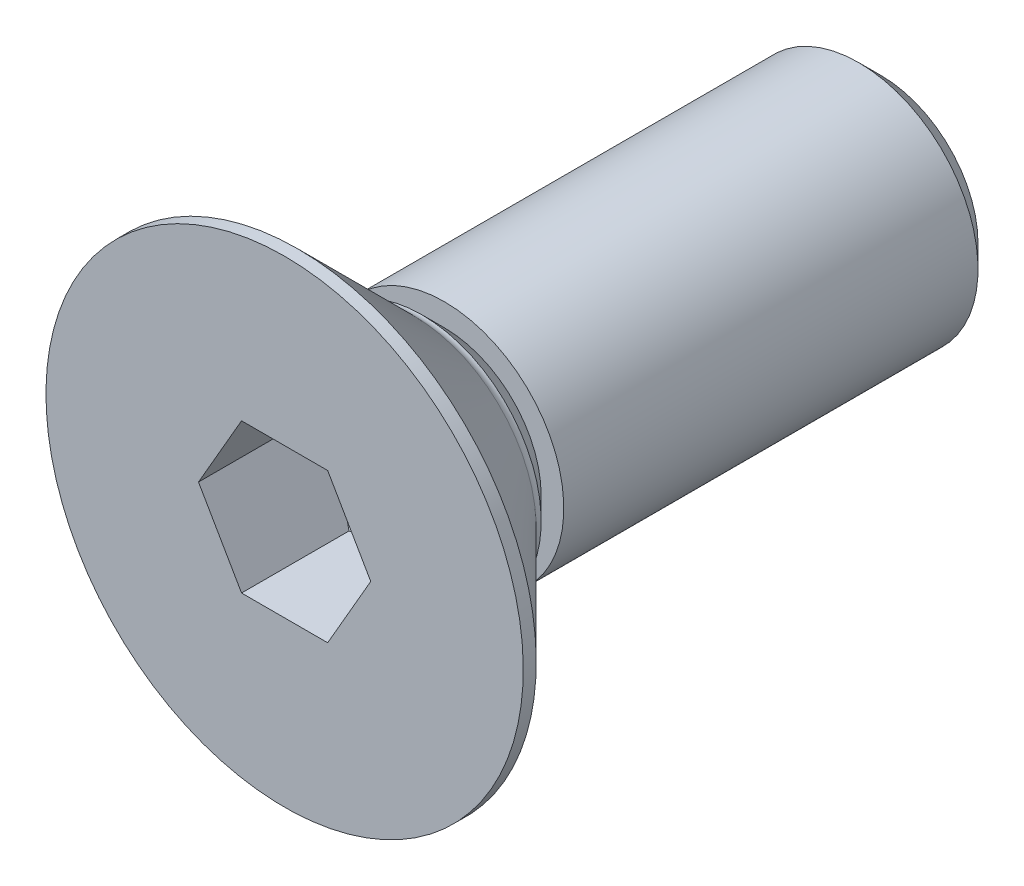
ISO-10303-21;
HEADER;
FILE_DESCRIPTION(('STEP AP214'),'2;1');
FILE_NAME('part.step','',(''),(''),'','','');
FILE_SCHEMA(('AUTOMOTIVE_DESIGN { 1 0 10303 214 1 1 1 1 }'));
ENDSEC;
DATA;
#1=APPLICATION_CONTEXT('core data for automotive mechanical design processes');
#2=APPLICATION_PROTOCOL_DEFINITION('international standard','automotive_design',2000,#1);
#3=PRODUCT_CONTEXT('',#1,'mechanical');
#4=PRODUCT('Part','Part','',(#3));
#5=PRODUCT_RELATED_PRODUCT_CATEGORY('part','',(#4));
#6=PRODUCT_DEFINITION_FORMATION('','',#4);
#7=PRODUCT_DEFINITION_CONTEXT('part definition',#1,'design');
#8=PRODUCT_DEFINITION('design','',#6,#7);
#9=PRODUCT_DEFINITION_SHAPE('','',#8);
#10=(LENGTH_UNIT() NAMED_UNIT(*) SI_UNIT(.MILLI.,.METRE.));
#11=(NAMED_UNIT(*) PLANE_ANGLE_UNIT() SI_UNIT($,.RADIAN.));
#12=(NAMED_UNIT(*) SI_UNIT($,.STERADIAN.) SOLID_ANGLE_UNIT());
#13=UNCERTAINTY_MEASURE_WITH_UNIT(LENGTH_MEASURE(1.E-05),#10,'distance_accuracy_value','');
#14=(GEOMETRIC_REPRESENTATION_CONTEXT(3) GLOBAL_UNCERTAINTY_ASSIGNED_CONTEXT((#13)) GLOBAL_UNIT_ASSIGNED_CONTEXT((#10,
#11,#12)) REPRESENTATION_CONTEXT('',''));
#15=CARTESIAN_POINT('',(0.,0.,0.));
#16=DIRECTION('',(0.,0.,1.));
#17=DIRECTION('',(1.,0.,0.));
#18=AXIS2_PLACEMENT_3D('',#15,#16,#17);
#19=CARTESIAN_POINT('',(0.,0.8105625,-10.));
#20=DIRECTION('',(0.,0.,-1.));
#21=DIRECTION('',(0.,1.,0.));
#22=AXIS2_PLACEMENT_3D('',#19,#20,#21);
#23=PLANE('',#22);
#24=CARTESIAN_POINT('',(0.,0.,-10.));
#25=DIRECTION('',(0.,0.,-1.));
#26=DIRECTION('',(0.,1.,0.));
#27=AXIS2_PLACEMENT_3D('',#24,#25,#26);
#28=CIRCLE('',#27,1.621125);
#29=CARTESIAN_POINT('',(0.,1.621125,-10.));
#30=VERTEX_POINT('',#29);
#31=EDGE_CURVE('E12',#30,#30,#28,.T.);
#32=ORIENTED_EDGE('',*,*,#31,.T.);
#33=EDGE_LOOP('',(#32));
#34=FACE_BOUND('',#33,.T.);
#35=ADVANCED_FACE('F19',(#34),#23,.T.);
#36=CARTESIAN_POINT('',(0.,0.,-9.8105625));
#37=DIRECTION('',(0.,0.,1.));
#38=DIRECTION('',(0.,1.,0.));
#39=AXIS2_PLACEMENT_3D('',#36,#37,#38);
#40=CONICAL_SURFACE('',#39,1.8105625,0.785398163397448);
#41=CARTESIAN_POINT('',(0.,0.,-9.621125));
#42=DIRECTION('',(0.,0.,-1.));
#43=DIRECTION('',(0.,1.,0.));
#44=AXIS2_PLACEMENT_3D('',#41,#42,#43);
#45=CIRCLE('',#44,2.);
#46=CARTESIAN_POINT('',(0.,2.,-9.621125));
#47=VERTEX_POINT('',#46);
#48=EDGE_CURVE('E32',#47,#47,#45,.T.);
#49=ORIENTED_EDGE('',*,*,#48,.T.);
#50=EDGE_LOOP('',(#49));
#51=FACE_BOUND('',#50,.T.);
#52=ORIENTED_EDGE('',*,*,#31,.F.);
#53=EDGE_LOOP('',(#52));
#54=FACE_BOUND('',#53,.T.);
#55=ADVANCED_FACE('F257',(#51,#54),#40,.T.);
#56=CARTESIAN_POINT('',(0.,0.,-6.0605625));
#57=DIRECTION('',(0.,0.,1.));
#58=DIRECTION('',(0.,1.,0.));
#59=AXIS2_PLACEMENT_3D('',#56,#57,#58);
#60=CYLINDRICAL_SURFACE('',#59,2.);
#61=ORIENTED_EDGE('',*,*,#48,.F.);
#62=EDGE_LOOP('',(#61));
#63=FACE_BOUND('',#62,.T.);
#64=CARTESIAN_POINT('',(0.,0.,-2.678875));
#65=DIRECTION('',(0.,0.,-1.));
#66=DIRECTION('',(0.,1.,0.));
#67=AXIS2_PLACEMENT_3D('',#64,#65,#66);
#68=CIRCLE('',#67,2.);
#69=CARTESIAN_POINT('',(0.,-2.,-2.678875));
#70=VERTEX_POINT('',#69);
#71=EDGE_CURVE('E145',#70,#70,#68,.T.);
#72=ORIENTED_EDGE('',*,*,#71,.T.);
#73=EDGE_LOOP('',(#72));
#74=FACE_BOUND('',#73,.T.);
#75=ADVANCED_FACE('F21',(#63,#74),#60,.T.);
#76=CARTESIAN_POINT('',(0.,0.,-2.3));
#77=DIRECTION('',(0.,0.,-1.));
#78=DIRECTION('',(-1.,0.,0.));
#79=AXIS2_PLACEMENT_3D('',#76,#77,#78);
#80=TOROIDAL_SURFACE('',#79,2.2,0.2);
#81=CARTESIAN_POINT('',(0.,0.,-2.15857864376269));
#82=DIRECTION('',(0.,0.,-1.));
#83=DIRECTION('',(0.,1.,0.));
#84=AXIS2_PLACEMENT_3D('',#81,#82,#83);
#85=CIRCLE('',#84,2.05857864376269);
#86=CARTESIAN_POINT('',(0.,2.05857864376269,-2.15857864376269));
#87=VERTEX_POINT('',#86);
#88=EDGE_CURVE('E165',#87,#87,#85,.T.);
#89=ORIENTED_EDGE('',*,*,#88,.T.);
#90=EDGE_LOOP('',(#89));
#91=FACE_BOUND('',#90,.T.);
#92=CARTESIAN_POINT('',(0.,0.,-2.3));
#93=DIRECTION('',(0.,0.,-1.));
#94=DIRECTION('',(0.,1.,0.));
#95=AXIS2_PLACEMENT_3D('',#92,#93,#94);
#96=CIRCLE('',#95,2.);
#97=CARTESIAN_POINT('',(0.,2.,-2.3));
#98=VERTEX_POINT('',#97);
#99=EDGE_CURVE('E93',#98,#98,#96,.T.);
#100=ORIENTED_EDGE('',*,*,#99,.F.);
#101=EDGE_LOOP('',(#100));
#102=FACE_BOUND('',#101,.T.);
#103=ADVANCED_FACE('F264',(#91,#102),#80,.F.);
#104=CARTESIAN_POINT('',(0.,0.,-1.18786796564403));
#105=DIRECTION('',(0.,0.,1.));
#106=DIRECTION('',(0.,1.,0.));
#107=AXIS2_PLACEMENT_3D('',#104,#105,#106);
#108=CONICAL_SURFACE('',#107,3.02928932188135,0.785398163397448);
#109=CARTESIAN_POINT('',(0.,0.,-0.217157287525382));
#110=DIRECTION('',(0.,0.,-1.));
#111=DIRECTION('',(0.,1.,0.));
#112=AXIS2_PLACEMENT_3D('',#109,#110,#111);
#113=CIRCLE('',#112,4.);
#114=CARTESIAN_POINT('',(0.,4.,-0.217157287525381));
#115=VERTEX_POINT('',#114);
#116=EDGE_CURVE('E161',#115,#115,#113,.T.);
#117=ORIENTED_EDGE('',*,*,#116,.T.);
#118=EDGE_LOOP('',(#117));
#119=FACE_BOUND('',#118,.T.);
#120=ORIENTED_EDGE('',*,*,#88,.F.);
#121=EDGE_LOOP('',(#120));
#122=FACE_BOUND('',#121,.T.);
#123=ADVANCED_FACE('F266',(#119,#122),#108,.T.);
#124=CARTESIAN_POINT('',(0.,0.,-0.108578643762691));
#125=DIRECTION('',(0.,0.,1.));
#126=DIRECTION('',(0.,1.,0.));
#127=AXIS2_PLACEMENT_3D('',#124,#125,#126);
#128=CYLINDRICAL_SURFACE('',#127,4.);
#129=CARTESIAN_POINT('',(0.,0.,0.));
#130=DIRECTION('',(0.,0.,-1.));
#131=DIRECTION('',(0.,1.,0.));
#132=AXIS2_PLACEMENT_3D('',#129,#130,#131);
#133=CIRCLE('',#132,4.);
#134=CARTESIAN_POINT('',(0.,4.,0.));
#135=VERTEX_POINT('',#134);
#136=EDGE_CURVE('E166',#135,#135,#133,.T.);
#137=ORIENTED_EDGE('',*,*,#136,.T.);
#138=EDGE_LOOP('',(#137));
#139=FACE_BOUND('',#138,.T.);
#140=ORIENTED_EDGE('',*,*,#116,.F.);
#141=EDGE_LOOP('',(#140));
#142=FACE_BOUND('',#141,.T.);
#143=ADVANCED_FACE('F271',(#139,#142),#128,.T.);
#144=CARTESIAN_POINT('',(0.,2.,0.));
#145=DIRECTION('',(0.,0.,1.));
#146=DIRECTION('',(0.,-1.,0.));
#147=AXIS2_PLACEMENT_3D('',#144,#145,#146);
#148=PLANE('',#147);
#149=ORIENTED_EDGE('',*,*,#136,.F.);
#150=EDGE_LOOP('',(#149));
#151=FACE_BOUND('',#150,.T.);
#152=DIRECTION('',(-0.5,0.866025403784439,0.));
#153=VECTOR('',#152,1.);
#154=CARTESIAN_POINT('',(-1.51554395189222,0.125000291406317,0.));
#155=LINE('',#154,#153);
#156=CARTESIAN_POINT('',(-0.7216875,-1.24999941718736,0.));
#157=VERTEX_POINT('',#156);
#158=CARTESIAN_POINT('',(-1.443375,0.,0.));
#159=VERTEX_POINT('',#158);
#160=EDGE_CURVE('E211',#157,#159,#155,.T.);
#161=ORIENTED_EDGE('',*,*,#160,.T.);
#162=DIRECTION('',(0.5,0.866025403784439,0.));
#163=VECTOR('',#162,1.);
#164=CARTESIAN_POINT('',(-0.649518548107781,1.37499970859368,0.));
#165=LINE('',#164,#163);
#166=CARTESIAN_POINT('',(-0.7216875,1.24999941718736,0.));
#167=VERTEX_POINT('',#166);
#168=EDGE_CURVE('E84',#159,#167,#165,.T.);
#169=ORIENTED_EDGE('',*,*,#168,.T.);
#170=DIRECTION('',(1.,0.,0.));
#171=VECTOR('',#170,1.);
#172=CARTESIAN_POINT('',(0.,1.24999941718736,0.));
#173=LINE('',#172,#171);
#174=CARTESIAN_POINT('',(0.7216875,1.24999941718736,0.));
#175=VERTEX_POINT('',#174);
#176=EDGE_CURVE('E98',#167,#175,#173,.T.);
#177=ORIENTED_EDGE('',*,*,#176,.T.);
#178=DIRECTION('',(0.5,-0.866025403784439,0.));
#179=VECTOR('',#178,1.);
#180=CARTESIAN_POINT('',(0.649518548107781,1.37499970859368,0.));
#181=LINE('',#180,#179);
#182=CARTESIAN_POINT('',(1.443375,0.,0.));
#183=VERTEX_POINT('',#182);
#184=EDGE_CURVE('E104',#175,#183,#181,.T.);
#185=ORIENTED_EDGE('',*,*,#184,.T.);
#186=DIRECTION('',(-0.5,-0.866025403784439,0.));
#187=VECTOR('',#186,1.);
#188=CARTESIAN_POINT('',(1.51554395189222,0.125000291406318,0.));
#189=LINE('',#188,#187);
#190=CARTESIAN_POINT('',(0.7216875,-1.24999941718736,0.));
#191=VERTEX_POINT('',#190);
#192=EDGE_CURVE('E219',#183,#191,#189,.T.);
#193=ORIENTED_EDGE('',*,*,#192,.T.);
#194=DIRECTION('',(-1.,0.,0.));
#195=VECTOR('',#194,1.);
#196=CARTESIAN_POINT('',(0.,-1.24999941718736,0.));
#197=LINE('',#196,#195);
#198=EDGE_CURVE('E184',#191,#157,#197,.T.);
#199=ORIENTED_EDGE('',*,*,#198,.T.);
#200=EDGE_LOOP('',(#161,#169,#177,#185,#193,#199));
#201=FACE_BOUND('',#200,.T.);
#202=ADVANCED_FACE('F101',(#151,#201),#148,.T.);
#203=CARTESIAN_POINT('',(-1.08253125,0.624999708593682,1.));
#204=DIRECTION('',(-0.866025403784439,0.5,0.));
#205=DIRECTION('',(0.5,0.866025403784439,0.));
#206=AXIS2_PLACEMENT_3D('',#203,#204,#205);
#207=PLANE('',#206);
#208=ORIENTED_EDGE('',*,*,#168,.F.);
#209=DIRECTION('',(0.,0.,-1.));
#210=VECTOR('',#209,1.);
#211=CARTESIAN_POINT('',(-1.443375,0.,1.));
#212=LINE('',#211,#210);
#213=CARTESIAN_POINT('',(-1.443375,0.,-1.8));
#214=VERTEX_POINT('',#213);
#215=EDGE_CURVE('E80',#159,#214,#212,.T.);
#216=ORIENTED_EDGE('',*,*,#215,.T.);
#217=CARTESIAN_POINT('',(-1.443375,0.,-1.8));
#218=CARTESIAN_POINT('',(-1.08253125,0.624999708593685,-2.0083332361979));
#219=CARTESIAN_POINT('',(-0.7216875,1.24999941718736,-1.8));
#220=(BOUNDED_CURVE() B_SPLINE_CURVE(2,(#217,#218,#219),.UNSPECIFIED.,.F.,
.F.) B_SPLINE_CURVE_WITH_KNOTS((3,3),(0.,1.46054449161805),
.UNSPECIFIED.) CURVE() GEOMETRIC_REPRESENTATION_ITEM() RATIONAL_B_SPLINE_CURVE((1.,
1.15470053837925,1.)) REPRESENTATION_ITEM(''));
#221=CARTESIAN_POINT('',(-0.7216875,1.24999941718736,-1.8));
#222=VERTEX_POINT('',#221);
#223=EDGE_CURVE('E23',#214,#222,#220,.T.);
#224=ORIENTED_EDGE('',*,*,#223,.T.);
#225=DIRECTION('',(0.,0.,-1.));
#226=VECTOR('',#225,1.);
#227=CARTESIAN_POINT('',(-0.7216875,1.24999941718736,1.));
#228=LINE('',#227,#226);
#229=EDGE_CURVE('E107',#167,#222,#228,.T.);
#230=ORIENTED_EDGE('',*,*,#229,.F.);
#231=EDGE_LOOP('',(#208,#216,#224,#230));
#232=FACE_BOUND('',#231,.T.);
#233=ADVANCED_FACE('F290',(#232),#207,.F.);
#234=CARTESIAN_POINT('',(0.,1.24999941718736,1.));
#235=DIRECTION('',(0.,1.,0.));
#236=DIRECTION('',(1.,0.,0.));
#237=AXIS2_PLACEMENT_3D('',#234,#235,#236);
#238=PLANE('',#237);
#239=ORIENTED_EDGE('',*,*,#176,.F.);
#240=ORIENTED_EDGE('',*,*,#229,.T.);
#241=CARTESIAN_POINT('',(-0.7216875,1.24999941718736,-1.8));
#242=CARTESIAN_POINT('',(0.,1.24999941718737,-2.0083332361979));
#243=CARTESIAN_POINT('',(0.7216875,1.24999941718736,-1.8));
#244=(BOUNDED_CURVE() B_SPLINE_CURVE(2,(#241,#242,#243),.UNSPECIFIED.,.F.,
.F.) B_SPLINE_CURVE_WITH_KNOTS((3,3),(0.,1.46054449161806),
.UNSPECIFIED.) CURVE() GEOMETRIC_REPRESENTATION_ITEM() RATIONAL_B_SPLINE_CURVE((1.,
1.15470053837925,1.)) REPRESENTATION_ITEM(''));
#245=CARTESIAN_POINT('',(0.7216875,1.24999941718736,-1.8));
#246=VERTEX_POINT('',#245);
#247=EDGE_CURVE('E114',#222,#246,#244,.T.);
#248=ORIENTED_EDGE('',*,*,#247,.T.);
#249=DIRECTION('',(0.,0.,-1.));
#250=VECTOR('',#249,1.);
#251=CARTESIAN_POINT('',(0.7216875,1.24999941718736,1.));
#252=LINE('',#251,#250);
#253=EDGE_CURVE('E111',#175,#246,#252,.T.);
#254=ORIENTED_EDGE('',*,*,#253,.F.);
#255=EDGE_LOOP('',(#239,#240,#248,#254));
#256=FACE_BOUND('',#255,.T.);
#257=ADVANCED_FACE('F112',(#256),#238,.F.);
#258=CARTESIAN_POINT('',(-1.08253125,-0.624999708593682,1.));
#259=DIRECTION('',(-0.866025403784439,-0.5,0.));
#260=DIRECTION('',(-0.5,0.866025403784439,0.));
#261=AXIS2_PLACEMENT_3D('',#258,#259,#260);
#262=PLANE('',#261);
#263=ORIENTED_EDGE('',*,*,#160,.F.);
#264=DIRECTION('',(0.,0.,-1.));
#265=VECTOR('',#264,1.);
#266=CARTESIAN_POINT('',(-0.7216875,-1.24999941718736,1.));
#267=LINE('',#266,#265);
#268=CARTESIAN_POINT('',(-0.7216875,-1.24999941718736,-1.8));
#269=VERTEX_POINT('',#268);
#270=EDGE_CURVE('E151',#157,#269,#267,.T.);
#271=ORIENTED_EDGE('',*,*,#270,.T.);
#272=CARTESIAN_POINT('',(-0.7216875,-1.24999941718736,-1.8));
#273=CARTESIAN_POINT('',(-1.08253125,-0.624999708593682,-2.0083332361979));
#274=CARTESIAN_POINT('',(-1.443375,0.,-1.8));
#275=(BOUNDED_CURVE() B_SPLINE_CURVE(2,(#272,#273,#274),.UNSPECIFIED.,.F.,
.F.) B_SPLINE_CURVE_WITH_KNOTS((3,3),(0.,1.46054449161805),
.UNSPECIFIED.) CURVE() GEOMETRIC_REPRESENTATION_ITEM() RATIONAL_B_SPLINE_CURVE((1.,
1.15470053837925,1.)) REPRESENTATION_ITEM(''));
#276=EDGE_CURVE('E215',#269,#214,#275,.T.);
#277=ORIENTED_EDGE('',*,*,#276,.T.);
#278=ORIENTED_EDGE('',*,*,#215,.F.);
#279=EDGE_LOOP('',(#263,#271,#277,#278));
#280=FACE_BOUND('',#279,.T.);
#281=ADVANCED_FACE('F289',(#280),#262,.F.);
#282=CARTESIAN_POINT('',(0.,0.,-2.21666647239579));
#283=DIRECTION('',(0.,0.,1.));
#284=DIRECTION('',(0.,1.,0.));
#285=AXIS2_PLACEMENT_3D('',#282,#283,#284);
#286=CONICAL_SURFACE('',#285,0.7216875,1.0471975511966);
#287=CARTESIAN_POINT('',(0.,0.,-2.63333294479158));
#288=VERTEX_POINT('',#287);
#289=VERTEX_LOOP('',#288);
#290=FACE_BOUND('',#289,.T.);
#291=CARTESIAN_POINT('',(0.7216875,1.24999941718736,-1.8));
#292=CARTESIAN_POINT('',(1.08253125,0.624999708593683,-2.00833323619789));
#293=CARTESIAN_POINT('',(1.443375,0.,-1.8));
#294=(BOUNDED_CURVE() B_SPLINE_CURVE(2,(#291,#292,#293),.UNSPECIFIED.,.F.,
.F.) B_SPLINE_CURVE_WITH_KNOTS((3,3),(0.,1.46054449161805),
.UNSPECIFIED.) CURVE() GEOMETRIC_REPRESENTATION_ITEM() RATIONAL_B_SPLINE_CURVE((1.,
1.15470053837925,1.)) REPRESENTATION_ITEM(''));
#295=CARTESIAN_POINT('',(1.443375,0.,-1.8));
#296=VERTEX_POINT('',#295);
#297=EDGE_CURVE('E119',#246,#296,#294,.T.);
#298=ORIENTED_EDGE('',*,*,#297,.F.);
#299=ORIENTED_EDGE('',*,*,#247,.F.);
#300=ORIENTED_EDGE('',*,*,#223,.F.);
#301=ORIENTED_EDGE('',*,*,#276,.F.);
#302=CARTESIAN_POINT('',(0.7216875,-1.24999941718736,-1.8));
#303=CARTESIAN_POINT('',(0.,-1.24999941718737,-2.0083332361979));
#304=CARTESIAN_POINT('',(-0.7216875,-1.24999941718736,-1.8));
#305=(BOUNDED_CURVE() B_SPLINE_CURVE(2,(#302,#303,#304),.UNSPECIFIED.,.F.,
.F.) B_SPLINE_CURVE_WITH_KNOTS((3,3),(0.,1.46054449161806),
.UNSPECIFIED.) CURVE() GEOMETRIC_REPRESENTATION_ITEM() RATIONAL_B_SPLINE_CURVE((1.,
1.15470053837925,1.)) REPRESENTATION_ITEM(''));
#306=CARTESIAN_POINT('',(0.7216875,-1.24999941718736,-1.8));
#307=VERTEX_POINT('',#306);
#308=EDGE_CURVE('E189',#307,#269,#305,.T.);
#309=ORIENTED_EDGE('',*,*,#308,.F.);
#310=CARTESIAN_POINT('',(1.443375,0.,-1.8));
#311=CARTESIAN_POINT('',(1.08253125,-0.624999708593683,-2.00833323619789));
#312=CARTESIAN_POINT('',(0.7216875,-1.24999941718736,-1.8));
#313=(BOUNDED_CURVE() B_SPLINE_CURVE(2,(#310,#311,#312),.UNSPECIFIED.,.F.,
.F.) B_SPLINE_CURVE_WITH_KNOTS((3,3),(0.,1.46054449161805),
.UNSPECIFIED.) CURVE() GEOMETRIC_REPRESENTATION_ITEM() RATIONAL_B_SPLINE_CURVE((1.,
1.15470053837925,1.)) REPRESENTATION_ITEM(''));
#314=EDGE_CURVE('E190',#296,#307,#313,.T.);
#315=ORIENTED_EDGE('',*,*,#314,.F.);
#316=EDGE_LOOP('',(#298,#299,#300,#301,#309,#315));
#317=FACE_BOUND('',#316,.T.);
#318=ADVANCED_FACE('F236',(#290,#317),#286,.F.);
#319=CARTESIAN_POINT('',(0.,-1.24999941718736,1.));
#320=DIRECTION('',(0.,-1.,0.));
#321=DIRECTION('',(-1.,0.,0.));
#322=AXIS2_PLACEMENT_3D('',#319,#320,#321);
#323=PLANE('',#322);
#324=ORIENTED_EDGE('',*,*,#198,.F.);
#325=DIRECTION('',(0.,0.,-1.));
#326=VECTOR('',#325,1.);
#327=CARTESIAN_POINT('',(0.7216875,-1.24999941718736,1.));
#328=LINE('',#327,#326);
#329=EDGE_CURVE('E133',#191,#307,#328,.T.);
#330=ORIENTED_EDGE('',*,*,#329,.T.);
#331=ORIENTED_EDGE('',*,*,#308,.T.);
#332=ORIENTED_EDGE('',*,*,#270,.F.);
#333=EDGE_LOOP('',(#324,#330,#331,#332));
#334=FACE_BOUND('',#333,.T.);
#335=ADVANCED_FACE('F232',(#334),#323,.F.);
#336=CARTESIAN_POINT('',(1.08253125,-0.624999708593682,1.));
#337=DIRECTION('',(0.866025403784439,-0.5,0.));
#338=DIRECTION('',(-0.5,-0.866025403784439,0.));
#339=AXIS2_PLACEMENT_3D('',#336,#337,#338);
#340=PLANE('',#339);
#341=ORIENTED_EDGE('',*,*,#192,.F.);
#342=DIRECTION('',(0.,0.,-1.));
#343=VECTOR('',#342,1.);
#344=CARTESIAN_POINT('',(1.443375,0.,1.));
#345=LINE('',#344,#343);
#346=EDGE_CURVE('E124',#183,#296,#345,.T.);
#347=ORIENTED_EDGE('',*,*,#346,.T.);
#348=ORIENTED_EDGE('',*,*,#314,.T.);
#349=ORIENTED_EDGE('',*,*,#329,.F.);
#350=EDGE_LOOP('',(#341,#347,#348,#349));
#351=FACE_BOUND('',#350,.T.);
#352=ADVANCED_FACE('F234',(#351),#340,.F.);
#353=CARTESIAN_POINT('',(1.08253125,0.624999708593682,1.));
#354=DIRECTION('',(0.866025403784439,0.5,0.));
#355=DIRECTION('',(0.5,-0.866025403784439,0.));
#356=AXIS2_PLACEMENT_3D('',#353,#354,#355);
#357=PLANE('',#356);
#358=ORIENTED_EDGE('',*,*,#184,.F.);
#359=ORIENTED_EDGE('',*,*,#253,.T.);
#360=ORIENTED_EDGE('',*,*,#297,.T.);
#361=ORIENTED_EDGE('',*,*,#346,.F.);
#362=EDGE_LOOP('',(#358,#359,#360,#361));
#363=FACE_BOUND('',#362,.T.);
#364=ADVANCED_FACE('F122',(#363),#357,.F.);
#365=CARTESIAN_POINT('',(0.,0.,-2.4894375));
#366=DIRECTION('',(0.,0.,1.));
#367=DIRECTION('',(0.,1.,0.));
#368=AXIS2_PLACEMENT_3D('',#365,#366,#367);
#369=CONICAL_SURFACE('',#368,1.8105625,0.785398163397448);
#370=CARTESIAN_POINT('',(0.,0.,-2.678875));
#371=DIRECTION('',(0.,0.,-1.));
#372=DIRECTION('',(0.,1.,0.));
#373=AXIS2_PLACEMENT_3D('',#370,#371,#372);
#374=CIRCLE('',#373,1.621125);
#375=CARTESIAN_POINT('',(0.,1.621125,-2.678875));
#376=VERTEX_POINT('',#375);
#377=EDGE_CURVE('E129',#376,#376,#374,.T.);
#378=ORIENTED_EDGE('',*,*,#377,.F.);
#379=EDGE_LOOP('',(#378));
#380=FACE_BOUND('',#379,.T.);
#381=ORIENTED_EDGE('',*,*,#99,.T.);
#382=EDGE_LOOP('',(#381));
#383=FACE_BOUND('',#382,.T.);
#384=ADVANCED_FACE('F247',(#380,#383),#369,.T.);
#385=CARTESIAN_POINT('',(0.,2.3105625,-2.678875));
#386=DIRECTION('',(0.,0.,-1.));
#387=DIRECTION('',(0.,1.,0.));
#388=AXIS2_PLACEMENT_3D('',#385,#386,#387);
#389=PLANE('',#388);
#390=ORIENTED_EDGE('',*,*,#377,.T.);
#391=EDGE_LOOP('',(#390));
#392=FACE_BOUND('',#391,.T.);
#393=ORIENTED_EDGE('',*,*,#71,.F.);
#394=EDGE_LOOP('',(#393));
#395=FACE_BOUND('',#394,.T.);
#396=ADVANCED_FACE('F245',(#392,#395),#389,.F.);
#397=CLOSED_SHELL('',(#35,#55,#75,#103,#123,#143,#202,#233,#257,#281,#318,#335,#352,#364,#384,#396));
#398=MANIFOLD_SOLID_BREP('B1',#397);
#399=ADVANCED_BREP_SHAPE_REPRESENTATION('',(#18,#398),#14);
#400=SHAPE_DEFINITION_REPRESENTATION(#9,#399);
ENDSEC;
END-ISO-10303-21;
